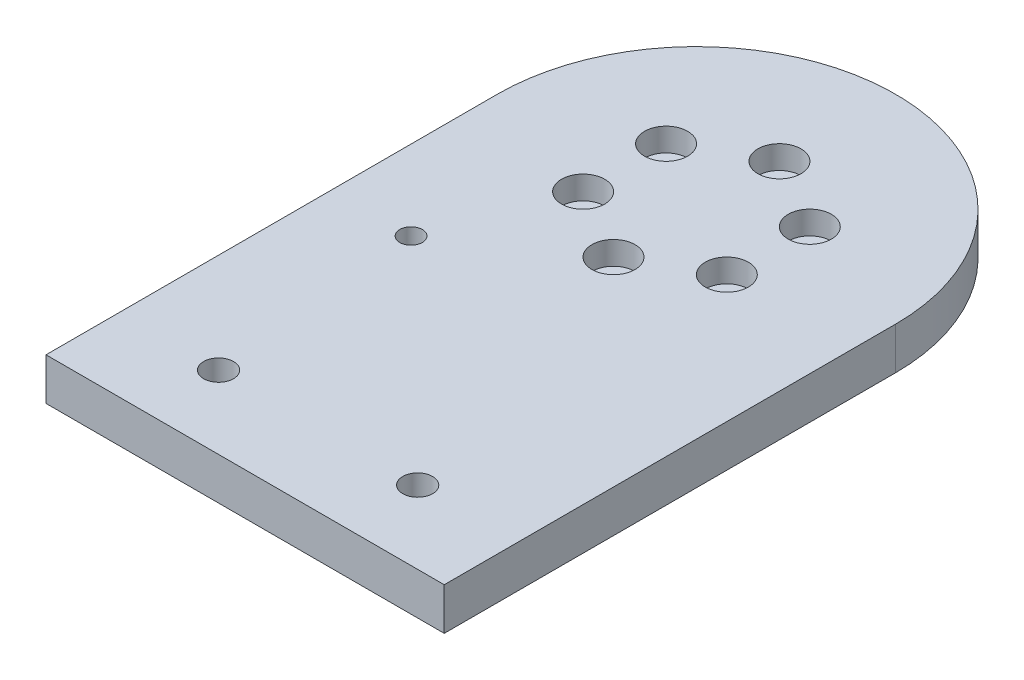
ISO-10303-21;
HEADER;
FILE_DESCRIPTION(('STEP AP214'),'2;1');
FILE_NAME('part.step','',(''),(''),'','','');
FILE_SCHEMA(('AUTOMOTIVE_DESIGN { 1 0 10303 214 1 1 1 1 }'));
ENDSEC;
DATA;
#1=APPLICATION_CONTEXT('core data for automotive mechanical design processes');
#2=APPLICATION_PROTOCOL_DEFINITION('international standard','automotive_design',2000,#1);
#3=PRODUCT_CONTEXT('',#1,'mechanical');
#4=PRODUCT('Part','Part','',(#3));
#5=PRODUCT_RELATED_PRODUCT_CATEGORY('part','',(#4));
#6=PRODUCT_DEFINITION_FORMATION('','',#4);
#7=PRODUCT_DEFINITION_CONTEXT('part definition',#1,'design');
#8=PRODUCT_DEFINITION('design','',#6,#7);
#9=PRODUCT_DEFINITION_SHAPE('','',#8);
#10=(LENGTH_UNIT() NAMED_UNIT(*) SI_UNIT(.MILLI.,.METRE.));
#11=(NAMED_UNIT(*) PLANE_ANGLE_UNIT() SI_UNIT($,.RADIAN.));
#12=(NAMED_UNIT(*) SI_UNIT($,.STERADIAN.) SOLID_ANGLE_UNIT());
#13=UNCERTAINTY_MEASURE_WITH_UNIT(LENGTH_MEASURE(1.E-05),#10,'distance_accuracy_value','');
#14=(GEOMETRIC_REPRESENTATION_CONTEXT(3) GLOBAL_UNCERTAINTY_ASSIGNED_CONTEXT((#13)) GLOBAL_UNIT_ASSIGNED_CONTEXT((#10,
#11,#12)) REPRESENTATION_CONTEXT('',''));
#15=CARTESIAN_POINT('',(0.,0.,0.));
#16=DIRECTION('',(0.,0.,1.));
#17=DIRECTION('',(1.,0.,0.));
#18=AXIS2_PLACEMENT_3D('',#15,#16,#17);
#19=CARTESIAN_POINT('',(10.8253175473055,66.1,336.25));
#20=DIRECTION('',(0.,-1.,0.));
#21=DIRECTION('',(0.,0.,-1.));
#22=AXIS2_PLACEMENT_3D('',#19,#20,#21);
#23=CYLINDRICAL_SURFACE('',#22,1.7);
#24=CARTESIAN_POINT('',(10.8253175473055,59.75,336.25));
#25=DIRECTION('',(0.,1.,0.));
#26=DIRECTION('',(0.,0.,1.));
#27=AXIS2_PLACEMENT_3D('',#24,#25,#26);
#28=CIRCLE('',#27,1.7);
#29=CARTESIAN_POINT('',(10.8253175473055,59.75,337.95));
#30=VERTEX_POINT('',#29);
#31=EDGE_CURVE('E151',#30,#30,#28,.T.);
#32=ORIENTED_EDGE('',*,*,#31,.F.);
#33=EDGE_LOOP('',(#32));
#34=FACE_BOUND('',#33,.T.);
#35=CARTESIAN_POINT('',(10.8253175473055,62.6,336.25));
#36=DIRECTION('',(0.,1.,0.));
#37=DIRECTION('',(0.,0.,1.));
#38=AXIS2_PLACEMENT_3D('',#35,#36,#37);
#39=CIRCLE('',#38,1.7);
#40=CARTESIAN_POINT('',(10.8253175473055,62.6,337.95));
#41=VERTEX_POINT('',#40);
#42=EDGE_CURVE('E43',#41,#41,#39,.T.);
#43=ORIENTED_EDGE('',*,*,#42,.T.);
#44=EDGE_LOOP('',(#43));
#45=FACE_BOUND('',#44,.T.);
#46=ADVANCED_FACE('F39',(#34,#45),#23,.F.);
#47=CARTESIAN_POINT('',(0.,66.1,342.5));
#48=DIRECTION('',(0.,-1.,0.));
#49=DIRECTION('',(0.,0.,-1.));
#50=AXIS2_PLACEMENT_3D('',#47,#48,#49);
#51=CYLINDRICAL_SURFACE('',#50,1.7);
#52=CARTESIAN_POINT('',(0.,59.75,342.5));
#53=DIRECTION('',(0.,1.,0.));
#54=DIRECTION('',(0.,0.,1.));
#55=AXIS2_PLACEMENT_3D('',#52,#53,#54);
#56=CIRCLE('',#55,1.7);
#57=CARTESIAN_POINT('',(0.,59.75,344.2));
#58=VERTEX_POINT('',#57);
#59=EDGE_CURVE('E147',#58,#58,#56,.T.);
#60=ORIENTED_EDGE('',*,*,#59,.F.);
#61=EDGE_LOOP('',(#60));
#62=FACE_BOUND('',#61,.T.);
#63=CARTESIAN_POINT('',(0.,62.6,342.5));
#64=DIRECTION('',(0.,1.,0.));
#65=DIRECTION('',(0.,0.,1.));
#66=AXIS2_PLACEMENT_3D('',#63,#64,#65);
#67=CIRCLE('',#66,1.7);
#68=CARTESIAN_POINT('',(0.,62.6,344.2));
#69=VERTEX_POINT('',#68);
#70=EDGE_CURVE('E183',#69,#69,#67,.T.);
#71=ORIENTED_EDGE('',*,*,#70,.T.);
#72=EDGE_LOOP('',(#71));
#73=FACE_BOUND('',#72,.T.);
#74=ADVANCED_FACE('F211',(#62,#73),#51,.F.);
#75=CARTESIAN_POINT('',(-10.8253175473055,66.1,336.25));
#76=DIRECTION('',(0.,-1.,0.));
#77=DIRECTION('',(0.,0.,-1.));
#78=AXIS2_PLACEMENT_3D('',#75,#76,#77);
#79=CYLINDRICAL_SURFACE('',#78,1.7);
#80=CARTESIAN_POINT('',(-10.8253175473055,59.75,336.25));
#81=DIRECTION('',(0.,1.,0.));
#82=DIRECTION('',(0.,0.,1.));
#83=AXIS2_PLACEMENT_3D('',#80,#81,#82);
#84=CIRCLE('',#83,1.7);
#85=CARTESIAN_POINT('',(-10.8253175473055,59.75,337.95));
#86=VERTEX_POINT('',#85);
#87=EDGE_CURVE('E155',#86,#86,#84,.T.);
#88=ORIENTED_EDGE('',*,*,#87,.F.);
#89=EDGE_LOOP('',(#88));
#90=FACE_BOUND('',#89,.T.);
#91=CARTESIAN_POINT('',(-10.8253175473055,62.6,336.25));
#92=DIRECTION('',(0.,1.,0.));
#93=DIRECTION('',(0.,0.,1.));
#94=AXIS2_PLACEMENT_3D('',#91,#92,#93);
#95=CIRCLE('',#94,1.7);
#96=CARTESIAN_POINT('',(-10.8253175473055,62.6,337.95));
#97=VERTEX_POINT('',#96);
#98=EDGE_CURVE('E185',#97,#97,#95,.T.);
#99=ORIENTED_EDGE('',*,*,#98,.T.);
#100=EDGE_LOOP('',(#99));
#101=FACE_BOUND('',#100,.T.);
#102=ADVANCED_FACE('F218',(#90,#101),#79,.F.);
#103=CARTESIAN_POINT('',(-10.8253175473055,66.1,323.75));
#104=DIRECTION('',(0.,-1.,0.));
#105=DIRECTION('',(0.,0.,-1.));
#106=AXIS2_PLACEMENT_3D('',#103,#104,#105);
#107=CYLINDRICAL_SURFACE('',#106,1.7);
#108=CARTESIAN_POINT('',(-10.8253175473055,59.75,323.75));
#109=DIRECTION('',(0.,1.,0.));
#110=DIRECTION('',(0.,0.,1.));
#111=AXIS2_PLACEMENT_3D('',#108,#109,#110);
#112=CIRCLE('',#111,1.7);
#113=CARTESIAN_POINT('',(-10.8253175473055,59.75,325.45));
#114=VERTEX_POINT('',#113);
#115=EDGE_CURVE('E154',#114,#114,#112,.T.);
#116=ORIENTED_EDGE('',*,*,#115,.F.);
#117=EDGE_LOOP('',(#116));
#118=FACE_BOUND('',#117,.T.);
#119=CARTESIAN_POINT('',(-10.8253175473055,62.6,323.75));
#120=DIRECTION('',(0.,1.,0.));
#121=DIRECTION('',(0.,0.,1.));
#122=AXIS2_PLACEMENT_3D('',#119,#120,#121);
#123=CIRCLE('',#122,1.7);
#124=CARTESIAN_POINT('',(-10.8253175473055,62.6,325.45));
#125=VERTEX_POINT('',#124);
#126=EDGE_CURVE('E177',#125,#125,#123,.T.);
#127=ORIENTED_EDGE('',*,*,#126,.T.);
#128=EDGE_LOOP('',(#127));
#129=FACE_BOUND('',#128,.T.);
#130=ADVANCED_FACE('F249',(#118,#129),#107,.F.);
#131=CARTESIAN_POINT('',(0.,66.1,317.5));
#132=DIRECTION('',(0.,-1.,0.));
#133=DIRECTION('',(0.,0.,-1.));
#134=AXIS2_PLACEMENT_3D('',#131,#132,#133);
#135=CYLINDRICAL_SURFACE('',#134,1.7);
#136=CARTESIAN_POINT('',(0.,59.75,317.5));
#137=DIRECTION('',(0.,1.,0.));
#138=DIRECTION('',(0.,0.,1.));
#139=AXIS2_PLACEMENT_3D('',#136,#137,#138);
#140=CIRCLE('',#139,1.7);
#141=CARTESIAN_POINT('',(0.,59.75,319.2));
#142=VERTEX_POINT('',#141);
#143=EDGE_CURVE('E157',#142,#142,#140,.T.);
#144=ORIENTED_EDGE('',*,*,#143,.F.);
#145=EDGE_LOOP('',(#144));
#146=FACE_BOUND('',#145,.T.);
#147=CARTESIAN_POINT('',(0.,62.6,317.5));
#148=DIRECTION('',(0.,1.,0.));
#149=DIRECTION('',(0.,0.,1.));
#150=AXIS2_PLACEMENT_3D('',#147,#148,#149);
#151=CIRCLE('',#150,1.7);
#152=CARTESIAN_POINT('',(0.,62.6,319.2));
#153=VERTEX_POINT('',#152);
#154=EDGE_CURVE('E176',#153,#153,#151,.T.);
#155=ORIENTED_EDGE('',*,*,#154,.T.);
#156=EDGE_LOOP('',(#155));
#157=FACE_BOUND('',#156,.T.);
#158=ADVANCED_FACE('F243',(#146,#157),#135,.F.);
#159=CARTESIAN_POINT('',(10.8253175473055,66.1,323.75));
#160=DIRECTION('',(0.,-1.,0.));
#161=DIRECTION('',(0.,0.,-1.));
#162=AXIS2_PLACEMENT_3D('',#159,#160,#161);
#163=CYLINDRICAL_SURFACE('',#162,1.7);
#164=CARTESIAN_POINT('',(10.8253175473055,59.75,323.75));
#165=DIRECTION('',(0.,1.,0.));
#166=DIRECTION('',(0.,0.,1.));
#167=AXIS2_PLACEMENT_3D('',#164,#165,#166);
#168=CIRCLE('',#167,1.7);
#169=CARTESIAN_POINT('',(10.8253175473055,59.75,325.45));
#170=VERTEX_POINT('',#169);
#171=EDGE_CURVE('E163',#170,#170,#168,.T.);
#172=ORIENTED_EDGE('',*,*,#171,.F.);
#173=EDGE_LOOP('',(#172));
#174=FACE_BOUND('',#173,.T.);
#175=CARTESIAN_POINT('',(10.8253175473055,62.6,323.75));
#176=DIRECTION('',(0.,1.,0.));
#177=DIRECTION('',(0.,0.,1.));
#178=AXIS2_PLACEMENT_3D('',#175,#176,#177);
#179=CIRCLE('',#178,1.7);
#180=CARTESIAN_POINT('',(10.8253175473055,62.6,325.45));
#181=VERTEX_POINT('',#180);
#182=EDGE_CURVE('E143',#181,#181,#179,.T.);
#183=ORIENTED_EDGE('',*,*,#182,.T.);
#184=EDGE_LOOP('',(#183));
#185=FACE_BOUND('',#184,.T.);
#186=ADVANCED_FACE('F222',(#174,#185),#163,.F.);
#187=CARTESIAN_POINT('',(30.,66.1,379.));
#188=DIRECTION('',(-1.,0.,0.));
#189=DIRECTION('',(0.,0.,1.));
#190=AXIS2_PLACEMENT_3D('',#187,#188,#189);
#191=PLANE('',#190);
#192=DIRECTION('',(0.,0.,-1.));
#193=VECTOR('',#192,1.);
#194=CARTESIAN_POINT('',(30.,59.75,379.));
#195=LINE('',#194,#193);
#196=CARTESIAN_POINT('',(30.,59.75,398.));
#197=VERTEX_POINT('',#196);
#198=CARTESIAN_POINT('',(30.,59.75,330.));
#199=VERTEX_POINT('',#198);
#200=EDGE_CURVE('E170',#197,#199,#195,.T.);
#201=ORIENTED_EDGE('',*,*,#200,.T.);
#202=DIRECTION('',(0.,-1.,0.));
#203=VECTOR('',#202,1.);
#204=CARTESIAN_POINT('',(30.,66.1,330.));
#205=LINE('',#204,#203);
#206=CARTESIAN_POINT('',(30.,66.1,330.));
#207=VERTEX_POINT('',#206);
#208=EDGE_CURVE('E11',#207,#199,#205,.T.);
#209=ORIENTED_EDGE('',*,*,#208,.F.);
#210=DIRECTION('',(0.,0.,-1.));
#211=VECTOR('',#210,1.);
#212=CARTESIAN_POINT('',(30.,66.1,379.));
#213=LINE('',#212,#211);
#214=CARTESIAN_POINT('',(30.,66.1,398.));
#215=VERTEX_POINT('',#214);
#216=EDGE_CURVE('E88',#215,#207,#213,.T.);
#217=ORIENTED_EDGE('',*,*,#216,.F.);
#218=DIRECTION('',(0.,-1.,0.));
#219=VECTOR('',#218,1.);
#220=CARTESIAN_POINT('',(30.,66.1,398.));
#221=LINE('',#220,#219);
#222=EDGE_CURVE('E100',#215,#197,#221,.T.);
#223=ORIENTED_EDGE('',*,*,#222,.T.);
#224=EDGE_LOOP('',(#201,#209,#217,#223));
#225=FACE_BOUND('',#224,.T.);
#226=ADVANCED_FACE('F41',(#225),#191,.F.);
#227=CARTESIAN_POINT('',(-30.,66.1,379.));
#228=DIRECTION('',(1.,0.,0.));
#229=DIRECTION('',(0.,0.,-1.));
#230=AXIS2_PLACEMENT_3D('',#227,#228,#229);
#231=PLANE('',#230);
#232=DIRECTION('',(0.,0.,1.));
#233=VECTOR('',#232,1.);
#234=CARTESIAN_POINT('',(-30.,59.75,379.));
#235=LINE('',#234,#233);
#236=CARTESIAN_POINT('',(-30.,59.75,330.));
#237=VERTEX_POINT('',#236);
#238=CARTESIAN_POINT('',(-30.,59.75,398.));
#239=VERTEX_POINT('',#238);
#240=EDGE_CURVE('E95',#237,#239,#235,.T.);
#241=ORIENTED_EDGE('',*,*,#240,.T.);
#242=DIRECTION('',(0.,-1.,0.));
#243=VECTOR('',#242,1.);
#244=CARTESIAN_POINT('',(-30.,66.1,398.));
#245=LINE('',#244,#243);
#246=CARTESIAN_POINT('',(-30.,66.1,398.));
#247=VERTEX_POINT('',#246);
#248=EDGE_CURVE('E93',#247,#239,#245,.T.);
#249=ORIENTED_EDGE('',*,*,#248,.F.);
#250=DIRECTION('',(0.,0.,1.));
#251=VECTOR('',#250,1.);
#252=CARTESIAN_POINT('',(-30.,66.1,379.));
#253=LINE('',#252,#251);
#254=CARTESIAN_POINT('',(-30.,66.1,330.));
#255=VERTEX_POINT('',#254);
#256=EDGE_CURVE('E79',#255,#247,#253,.T.);
#257=ORIENTED_EDGE('',*,*,#256,.F.);
#258=DIRECTION('',(0.,-1.,0.));
#259=VECTOR('',#258,1.);
#260=CARTESIAN_POINT('',(-30.,66.1,330.));
#261=LINE('',#260,#259);
#262=EDGE_CURVE('E48',#255,#237,#261,.T.);
#263=ORIENTED_EDGE('',*,*,#262,.T.);
#264=EDGE_LOOP('',(#241,#249,#257,#263));
#265=FACE_BOUND('',#264,.T.);
#266=ADVANCED_FACE('F94',(#265),#231,.F.);
#267=CARTESIAN_POINT('',(0.,66.1,0.));
#268=DIRECTION('',(0.,-1.,0.));
#269=DIRECTION('',(0.,0.,-1.));
#270=AXIS2_PLACEMENT_3D('',#267,#268,#269);
#271=PLANE('',#270);
#272=CARTESIAN_POINT('',(-18.,66.1,355.));
#273=DIRECTION('',(0.,1.,0.));
#274=DIRECTION('',(0.,0.,1.));
#275=AXIS2_PLACEMENT_3D('',#272,#273,#274);
#276=CIRCLE('',#275,1.7);
#277=CARTESIAN_POINT('',(-18.,66.1,356.7));
#278=VERTEX_POINT('',#277);
#279=EDGE_CURVE('E311',#278,#278,#276,.T.);
#280=ORIENTED_EDGE('',*,*,#279,.F.);
#281=EDGE_LOOP('',(#280));
#282=FACE_BOUND('',#281,.T.);
#283=CARTESIAN_POINT('',(-15.,66.1,387.));
#284=DIRECTION('',(0.,1.,0.));
#285=DIRECTION('',(0.,0.,1.));
#286=AXIS2_PLACEMENT_3D('',#283,#284,#285);
#287=CIRCLE('',#286,2.25);
#288=CARTESIAN_POINT('',(-15.,66.1,389.25));
#289=VERTEX_POINT('',#288);
#290=EDGE_CURVE('E106',#289,#289,#287,.T.);
#291=ORIENTED_EDGE('',*,*,#290,.F.);
#292=EDGE_LOOP('',(#291));
#293=FACE_BOUND('',#292,.T.);
#294=CARTESIAN_POINT('',(15.,66.1,387.));
#295=DIRECTION('',(0.,1.,0.));
#296=DIRECTION('',(0.,0.,1.));
#297=AXIS2_PLACEMENT_3D('',#294,#295,#296);
#298=CIRCLE('',#297,2.25);
#299=CARTESIAN_POINT('',(15.,66.1,389.25));
#300=VERTEX_POINT('',#299);
#301=EDGE_CURVE('E107',#300,#300,#298,.T.);
#302=ORIENTED_EDGE('',*,*,#301,.F.);
#303=EDGE_LOOP('',(#302));
#304=FACE_BOUND('',#303,.T.);
#305=CARTESIAN_POINT('',(10.8253175473055,66.1,323.75));
#306=DIRECTION('',(0.,1.,0.));
#307=DIRECTION('',(0.,0.,1.));
#308=AXIS2_PLACEMENT_3D('',#305,#306,#307);
#309=CIRCLE('',#308,3.25);
#310=CARTESIAN_POINT('',(10.8253175473055,66.1,327.));
#311=VERTEX_POINT('',#310);
#312=EDGE_CURVE('E96',#311,#311,#309,.T.);
#313=ORIENTED_EDGE('',*,*,#312,.F.);
#314=EDGE_LOOP('',(#313));
#315=FACE_BOUND('',#314,.T.);
#316=CARTESIAN_POINT('',(0.,66.1,317.5));
#317=DIRECTION('',(0.,1.,0.));
#318=DIRECTION('',(0.,0.,1.));
#319=AXIS2_PLACEMENT_3D('',#316,#317,#318);
#320=CIRCLE('',#319,3.25);
#321=CARTESIAN_POINT('',(0.,66.1,320.75));
#322=VERTEX_POINT('',#321);
#323=EDGE_CURVE('E132',#322,#322,#320,.T.);
#324=ORIENTED_EDGE('',*,*,#323,.F.);
#325=EDGE_LOOP('',(#324));
#326=FACE_BOUND('',#325,.T.);
#327=CARTESIAN_POINT('',(-10.8253175473055,66.1,323.75));
#328=DIRECTION('',(0.,1.,0.));
#329=DIRECTION('',(0.,0.,1.));
#330=AXIS2_PLACEMENT_3D('',#327,#328,#329);
#331=CIRCLE('',#330,3.25);
#332=CARTESIAN_POINT('',(-10.8253175473055,66.1,327.));
#333=VERTEX_POINT('',#332);
#334=EDGE_CURVE('E127',#333,#333,#331,.T.);
#335=ORIENTED_EDGE('',*,*,#334,.F.);
#336=EDGE_LOOP('',(#335));
#337=FACE_BOUND('',#336,.T.);
#338=CARTESIAN_POINT('',(-10.8253175473055,66.1,336.25));
#339=DIRECTION('',(0.,1.,0.));
#340=DIRECTION('',(0.,0.,1.));
#341=AXIS2_PLACEMENT_3D('',#338,#339,#340);
#342=CIRCLE('',#341,3.25);
#343=CARTESIAN_POINT('',(-10.8253175473055,66.1,339.5));
#344=VERTEX_POINT('',#343);
#345=EDGE_CURVE('E125',#344,#344,#342,.T.);
#346=ORIENTED_EDGE('',*,*,#345,.F.);
#347=EDGE_LOOP('',(#346));
#348=FACE_BOUND('',#347,.T.);
#349=CARTESIAN_POINT('',(0.,66.1,342.5));
#350=DIRECTION('',(0.,1.,0.));
#351=DIRECTION('',(0.,0.,1.));
#352=AXIS2_PLACEMENT_3D('',#349,#350,#351);
#353=CIRCLE('',#352,3.25);
#354=CARTESIAN_POINT('',(0.,66.1,345.75));
#355=VERTEX_POINT('',#354);
#356=EDGE_CURVE('E116',#355,#355,#353,.T.);
#357=ORIENTED_EDGE('',*,*,#356,.F.);
#358=EDGE_LOOP('',(#357));
#359=FACE_BOUND('',#358,.T.);
#360=CARTESIAN_POINT('',(10.8253175473055,66.1,336.25));
#361=DIRECTION('',(0.,1.,0.));
#362=DIRECTION('',(0.,0.,1.));
#363=AXIS2_PLACEMENT_3D('',#360,#361,#362);
#364=CIRCLE('',#363,3.25);
#365=CARTESIAN_POINT('',(10.8253175473055,66.1,339.5));
#366=VERTEX_POINT('',#365);
#367=EDGE_CURVE('E145',#366,#366,#364,.T.);
#368=ORIENTED_EDGE('',*,*,#367,.F.);
#369=EDGE_LOOP('',(#368));
#370=FACE_BOUND('',#369,.T.);
#371=ORIENTED_EDGE('',*,*,#216,.T.);
#372=CARTESIAN_POINT('',(0.,66.1,330.));
#373=DIRECTION('',(0.,1.,0.));
#374=DIRECTION('',(0.,0.,1.));
#375=AXIS2_PLACEMENT_3D('',#372,#373,#374);
#376=CIRCLE('',#375,30.);
#377=EDGE_CURVE('E86',#207,#255,#376,.T.);
#378=ORIENTED_EDGE('',*,*,#377,.T.);
#379=ORIENTED_EDGE('',*,*,#256,.T.);
#380=DIRECTION('',(1.,0.,0.));
#381=VECTOR('',#380,1.);
#382=CARTESIAN_POINT('',(-30.,66.1,398.));
#383=LINE('',#382,#381);
#384=EDGE_CURVE('E83',#247,#215,#383,.T.);
#385=ORIENTED_EDGE('',*,*,#384,.T.);
#386=EDGE_LOOP('',(#371,#378,#379,#385));
#387=FACE_BOUND('',#386,.T.);
#388=ADVANCED_FACE('F85',(#282,#293,#304,#315,#326,#337,#348,#359,#370,#387),#271,.F.);
#389=CARTESIAN_POINT('',(0.,59.75,0.));
#390=DIRECTION('',(0.,-1.,0.));
#391=DIRECTION('',(0.,0.,-1.));
#392=AXIS2_PLACEMENT_3D('',#389,#390,#391);
#393=PLANE('',#392);
#394=CARTESIAN_POINT('',(-18.,59.75,355.));
#395=DIRECTION('',(0.,1.,0.));
#396=DIRECTION('',(0.,0.,1.));
#397=AXIS2_PLACEMENT_3D('',#394,#395,#396);
#398=CIRCLE('',#397,1.7);
#399=CARTESIAN_POINT('',(-18.,59.75,356.7));
#400=VERTEX_POINT('',#399);
#401=EDGE_CURVE('E313',#400,#400,#398,.T.);
#402=ORIENTED_EDGE('',*,*,#401,.T.);
#403=EDGE_LOOP('',(#402));
#404=FACE_BOUND('',#403,.T.);
#405=CARTESIAN_POINT('',(-15.,59.75,387.));
#406=DIRECTION('',(0.,1.,0.));
#407=DIRECTION('',(0.,0.,1.));
#408=AXIS2_PLACEMENT_3D('',#405,#406,#407);
#409=CIRCLE('',#408,2.25);
#410=CARTESIAN_POINT('',(-15.,59.75,389.25));
#411=VERTEX_POINT('',#410);
#412=EDGE_CURVE('E318',#411,#411,#409,.T.);
#413=ORIENTED_EDGE('',*,*,#412,.T.);
#414=EDGE_LOOP('',(#413));
#415=FACE_BOUND('',#414,.T.);
#416=CARTESIAN_POINT('',(15.,59.75,387.));
#417=DIRECTION('',(0.,1.,0.));
#418=DIRECTION('',(0.,0.,1.));
#419=AXIS2_PLACEMENT_3D('',#416,#417,#418);
#420=CIRCLE('',#419,2.25);
#421=CARTESIAN_POINT('',(15.,59.75,389.25));
#422=VERTEX_POINT('',#421);
#423=EDGE_CURVE('E325',#422,#422,#420,.T.);
#424=ORIENTED_EDGE('',*,*,#423,.T.);
#425=EDGE_LOOP('',(#424));
#426=FACE_BOUND('',#425,.T.);
#427=ORIENTED_EDGE('',*,*,#171,.T.);
#428=EDGE_LOOP('',(#427));
#429=FACE_BOUND('',#428,.T.);
#430=ORIENTED_EDGE('',*,*,#143,.T.);
#431=EDGE_LOOP('',(#430));
#432=FACE_BOUND('',#431,.T.);
#433=ORIENTED_EDGE('',*,*,#115,.T.);
#434=EDGE_LOOP('',(#433));
#435=FACE_BOUND('',#434,.T.);
#436=ORIENTED_EDGE('',*,*,#87,.T.);
#437=EDGE_LOOP('',(#436));
#438=FACE_BOUND('',#437,.T.);
#439=ORIENTED_EDGE('',*,*,#59,.T.);
#440=EDGE_LOOP('',(#439));
#441=FACE_BOUND('',#440,.T.);
#442=ORIENTED_EDGE('',*,*,#31,.T.);
#443=EDGE_LOOP('',(#442));
#444=FACE_BOUND('',#443,.T.);
#445=ORIENTED_EDGE('',*,*,#240,.F.);
#446=CARTESIAN_POINT('',(0.,59.75,330.));
#447=DIRECTION('',(0.,1.,0.));
#448=DIRECTION('',(0.,0.,1.));
#449=AXIS2_PLACEMENT_3D('',#446,#447,#448);
#450=CIRCLE('',#449,30.);
#451=EDGE_CURVE('E54',#199,#237,#450,.T.);
#452=ORIENTED_EDGE('',*,*,#451,.F.);
#453=ORIENTED_EDGE('',*,*,#200,.F.);
#454=DIRECTION('',(1.,0.,0.));
#455=VECTOR('',#454,1.);
#456=CARTESIAN_POINT('',(-30.,59.75,398.));
#457=LINE('',#456,#455);
#458=EDGE_CURVE('E101',#239,#197,#457,.T.);
#459=ORIENTED_EDGE('',*,*,#458,.F.);
#460=EDGE_LOOP('',(#445,#452,#453,#459));
#461=FACE_BOUND('',#460,.T.);
#462=ADVANCED_FACE('F226',(#404,#415,#426,#429,#432,#435,#438,#441,#444,#461),#393,.T.);
#463=CARTESIAN_POINT('',(0.,66.1,330.));
#464=DIRECTION('',(0.,-1.,0.));
#465=DIRECTION('',(0.,0.,-1.));
#466=AXIS2_PLACEMENT_3D('',#463,#464,#465);
#467=CYLINDRICAL_SURFACE('',#466,30.);
#468=ORIENTED_EDGE('',*,*,#377,.F.);
#469=ORIENTED_EDGE('',*,*,#208,.T.);
#470=ORIENTED_EDGE('',*,*,#451,.T.);
#471=ORIENTED_EDGE('',*,*,#262,.F.);
#472=EDGE_LOOP('',(#468,#469,#470,#471));
#473=FACE_BOUND('',#472,.T.);
#474=ADVANCED_FACE('F221',(#473),#467,.T.);
#475=CARTESIAN_POINT('',(10.8253175473055,66.1,323.75));
#476=DIRECTION('',(0.,-1.,0.));
#477=DIRECTION('',(0.,0.,-1.));
#478=AXIS2_PLACEMENT_3D('',#475,#476,#477);
#479=CYLINDRICAL_SURFACE('',#478,3.25);
#480=ORIENTED_EDGE('',*,*,#312,.T.);
#481=EDGE_LOOP('',(#480));
#482=FACE_BOUND('',#481,.T.);
#483=CARTESIAN_POINT('',(10.8253175473055,62.6,323.75));
#484=DIRECTION('',(0.,1.,0.));
#485=DIRECTION('',(0.,0.,1.));
#486=AXIS2_PLACEMENT_3D('',#483,#484,#485);
#487=CIRCLE('',#486,3.25);
#488=CARTESIAN_POINT('',(10.8253175473055,62.6,327.));
#489=VERTEX_POINT('',#488);
#490=EDGE_CURVE('E139',#489,#489,#487,.T.);
#491=ORIENTED_EDGE('',*,*,#490,.F.);
#492=EDGE_LOOP('',(#491));
#493=FACE_BOUND('',#492,.T.);
#494=ADVANCED_FACE('F227',(#482,#493),#479,.F.);
#495=CARTESIAN_POINT('',(10.8253175473055,62.6,323.75));
#496=DIRECTION('',(0.,1.,0.));
#497=DIRECTION('',(0.,0.,1.));
#498=AXIS2_PLACEMENT_3D('',#495,#496,#497);
#499=PLANE('',#498);
#500=ORIENTED_EDGE('',*,*,#182,.F.);
#501=EDGE_LOOP('',(#500));
#502=FACE_BOUND('',#501,.T.);
#503=ORIENTED_EDGE('',*,*,#490,.T.);
#504=EDGE_LOOP('',(#503));
#505=FACE_BOUND('',#504,.T.);
#506=ADVANCED_FACE('F256',(#502,#505),#499,.T.);
#507=CARTESIAN_POINT('',(0.,66.1,317.5));
#508=DIRECTION('',(0.,-1.,0.));
#509=DIRECTION('',(0.,0.,-1.));
#510=AXIS2_PLACEMENT_3D('',#507,#508,#509);
#511=CYLINDRICAL_SURFACE('',#510,3.25);
#512=ORIENTED_EDGE('',*,*,#323,.T.);
#513=EDGE_LOOP('',(#512));
#514=FACE_BOUND('',#513,.T.);
#515=CARTESIAN_POINT('',(0.,62.6,317.5));
#516=DIRECTION('',(0.,1.,0.));
#517=DIRECTION('',(0.,0.,1.));
#518=AXIS2_PLACEMENT_3D('',#515,#516,#517);
#519=CIRCLE('',#518,3.25);
#520=CARTESIAN_POINT('',(0.,62.6,320.75));
#521=VERTEX_POINT('',#520);
#522=EDGE_CURVE('E131',#521,#521,#519,.T.);
#523=ORIENTED_EDGE('',*,*,#522,.F.);
#524=EDGE_LOOP('',(#523));
#525=FACE_BOUND('',#524,.T.);
#526=ADVANCED_FACE('F258',(#514,#525),#511,.F.);
#527=CARTESIAN_POINT('',(0.,62.6,317.5));
#528=DIRECTION('',(0.,1.,0.));
#529=DIRECTION('',(0.,0.,1.));
#530=AXIS2_PLACEMENT_3D('',#527,#528,#529);
#531=PLANE('',#530);
#532=ORIENTED_EDGE('',*,*,#154,.F.);
#533=EDGE_LOOP('',(#532));
#534=FACE_BOUND('',#533,.T.);
#535=ORIENTED_EDGE('',*,*,#522,.T.);
#536=EDGE_LOOP('',(#535));
#537=FACE_BOUND('',#536,.T.);
#538=ADVANCED_FACE('F267',(#534,#537),#531,.T.);
#539=CARTESIAN_POINT('',(-10.8253175473055,66.1,323.75));
#540=DIRECTION('',(0.,-1.,0.));
#541=DIRECTION('',(0.,0.,-1.));
#542=AXIS2_PLACEMENT_3D('',#539,#540,#541);
#543=CYLINDRICAL_SURFACE('',#542,3.25);
#544=ORIENTED_EDGE('',*,*,#334,.T.);
#545=EDGE_LOOP('',(#544));
#546=FACE_BOUND('',#545,.T.);
#547=CARTESIAN_POINT('',(-10.8253175473055,62.6,323.75));
#548=DIRECTION('',(0.,1.,0.));
#549=DIRECTION('',(0.,0.,1.));
#550=AXIS2_PLACEMENT_3D('',#547,#548,#549);
#551=CIRCLE('',#550,3.25);
#552=CARTESIAN_POINT('',(-10.8253175473055,62.6,327.));
#553=VERTEX_POINT('',#552);
#554=EDGE_CURVE('E123',#553,#553,#551,.T.);
#555=ORIENTED_EDGE('',*,*,#554,.F.);
#556=EDGE_LOOP('',(#555));
#557=FACE_BOUND('',#556,.T.);
#558=ADVANCED_FACE('F272',(#546,#557),#543,.F.);
#559=CARTESIAN_POINT('',(-10.8253175473055,62.6,323.75));
#560=DIRECTION('',(0.,1.,0.));
#561=DIRECTION('',(0.,0.,1.));
#562=AXIS2_PLACEMENT_3D('',#559,#560,#561);
#563=PLANE('',#562);
#564=ORIENTED_EDGE('',*,*,#126,.F.);
#565=EDGE_LOOP('',(#564));
#566=FACE_BOUND('',#565,.T.);
#567=ORIENTED_EDGE('',*,*,#554,.T.);
#568=EDGE_LOOP('',(#567));
#569=FACE_BOUND('',#568,.T.);
#570=ADVANCED_FACE('F276',(#566,#569),#563,.T.);
#571=CARTESIAN_POINT('',(-10.8253175473055,66.1,336.25));
#572=DIRECTION('',(0.,-1.,0.));
#573=DIRECTION('',(0.,0.,-1.));
#574=AXIS2_PLACEMENT_3D('',#571,#572,#573);
#575=CYLINDRICAL_SURFACE('',#574,3.25);
#576=ORIENTED_EDGE('',*,*,#345,.T.);
#577=EDGE_LOOP('',(#576));
#578=FACE_BOUND('',#577,.T.);
#579=CARTESIAN_POINT('',(-10.8253175473055,62.6,336.25));
#580=DIRECTION('',(0.,1.,0.));
#581=DIRECTION('',(0.,0.,1.));
#582=AXIS2_PLACEMENT_3D('',#579,#580,#581);
#583=CIRCLE('',#582,3.25);
#584=CARTESIAN_POINT('',(-10.8253175473055,62.6,339.5));
#585=VERTEX_POINT('',#584);
#586=EDGE_CURVE('E118',#585,#585,#583,.T.);
#587=ORIENTED_EDGE('',*,*,#586,.F.);
#588=EDGE_LOOP('',(#587));
#589=FACE_BOUND('',#588,.T.);
#590=ADVANCED_FACE('F278',(#578,#589),#575,.F.);
#591=CARTESIAN_POINT('',(-10.8253175473055,62.6,336.25));
#592=DIRECTION('',(0.,1.,0.));
#593=DIRECTION('',(0.,0.,1.));
#594=AXIS2_PLACEMENT_3D('',#591,#592,#593);
#595=PLANE('',#594);
#596=ORIENTED_EDGE('',*,*,#98,.F.);
#597=EDGE_LOOP('',(#596));
#598=FACE_BOUND('',#597,.T.);
#599=ORIENTED_EDGE('',*,*,#586,.T.);
#600=EDGE_LOOP('',(#599));
#601=FACE_BOUND('',#600,.T.);
#602=ADVANCED_FACE('F282',(#598,#601),#595,.T.);
#603=CARTESIAN_POINT('',(0.,66.1,342.5));
#604=DIRECTION('',(0.,-1.,0.));
#605=DIRECTION('',(0.,0.,-1.));
#606=AXIS2_PLACEMENT_3D('',#603,#604,#605);
#607=CYLINDRICAL_SURFACE('',#606,3.25);
#608=ORIENTED_EDGE('',*,*,#356,.T.);
#609=EDGE_LOOP('',(#608));
#610=FACE_BOUND('',#609,.T.);
#611=CARTESIAN_POINT('',(0.,62.6,342.5));
#612=DIRECTION('',(0.,1.,0.));
#613=DIRECTION('',(0.,0.,1.));
#614=AXIS2_PLACEMENT_3D('',#611,#612,#613);
#615=CIRCLE('',#614,3.25);
#616=CARTESIAN_POINT('',(0.,62.6,345.75));
#617=VERTEX_POINT('',#616);
#618=EDGE_CURVE('E115',#617,#617,#615,.T.);
#619=ORIENTED_EDGE('',*,*,#618,.F.);
#620=EDGE_LOOP('',(#619));
#621=FACE_BOUND('',#620,.T.);
#622=ADVANCED_FACE('F207',(#610,#621),#607,.F.);
#623=CARTESIAN_POINT('',(0.,62.6,342.5));
#624=DIRECTION('',(0.,1.,0.));
#625=DIRECTION('',(0.,0.,1.));
#626=AXIS2_PLACEMENT_3D('',#623,#624,#625);
#627=PLANE('',#626);
#628=ORIENTED_EDGE('',*,*,#70,.F.);
#629=EDGE_LOOP('',(#628));
#630=FACE_BOUND('',#629,.T.);
#631=ORIENTED_EDGE('',*,*,#618,.T.);
#632=EDGE_LOOP('',(#631));
#633=FACE_BOUND('',#632,.T.);
#634=ADVANCED_FACE('F199',(#630,#633),#627,.T.);
#635=CARTESIAN_POINT('',(10.8253175473055,66.1,336.25));
#636=DIRECTION('',(0.,-1.,0.));
#637=DIRECTION('',(0.,0.,-1.));
#638=AXIS2_PLACEMENT_3D('',#635,#636,#637);
#639=CYLINDRICAL_SURFACE('',#638,3.25);
#640=ORIENTED_EDGE('',*,*,#367,.T.);
#641=EDGE_LOOP('',(#640));
#642=FACE_BOUND('',#641,.T.);
#643=CARTESIAN_POINT('',(10.8253175473055,62.6,336.25));
#644=DIRECTION('',(0.,1.,0.));
#645=DIRECTION('',(0.,0.,1.));
#646=AXIS2_PLACEMENT_3D('',#643,#644,#645);
#647=CIRCLE('',#646,3.25);
#648=CARTESIAN_POINT('',(10.8253175473055,62.6,339.5));
#649=VERTEX_POINT('',#648);
#650=EDGE_CURVE('E114',#649,#649,#647,.T.);
#651=ORIENTED_EDGE('',*,*,#650,.F.);
#652=EDGE_LOOP('',(#651));
#653=FACE_BOUND('',#652,.T.);
#654=ADVANCED_FACE('F194',(#642,#653),#639,.F.);
#655=CARTESIAN_POINT('',(10.8253175473055,62.6,336.25));
#656=DIRECTION('',(0.,1.,0.));
#657=DIRECTION('',(0.,0.,1.));
#658=AXIS2_PLACEMENT_3D('',#655,#656,#657);
#659=PLANE('',#658);
#660=ORIENTED_EDGE('',*,*,#42,.F.);
#661=EDGE_LOOP('',(#660));
#662=FACE_BOUND('',#661,.T.);
#663=ORIENTED_EDGE('',*,*,#650,.T.);
#664=EDGE_LOOP('',(#663));
#665=FACE_BOUND('',#664,.T.);
#666=ADVANCED_FACE('F195',(#662,#665),#659,.T.);
#667=CARTESIAN_POINT('',(-30.,66.1,398.));
#668=DIRECTION('',(0.,0.,-1.));
#669=DIRECTION('',(-1.,0.,0.));
#670=AXIS2_PLACEMENT_3D('',#667,#668,#669);
#671=PLANE('',#670);
#672=ORIENTED_EDGE('',*,*,#458,.T.);
#673=ORIENTED_EDGE('',*,*,#222,.F.);
#674=ORIENTED_EDGE('',*,*,#384,.F.);
#675=ORIENTED_EDGE('',*,*,#248,.T.);
#676=EDGE_LOOP('',(#672,#673,#674,#675));
#677=FACE_BOUND('',#676,.T.);
#678=ADVANCED_FACE('F103',(#677),#671,.F.);
#679=CARTESIAN_POINT('',(15.,66.1,387.));
#680=DIRECTION('',(0.,-1.,0.));
#681=DIRECTION('',(0.,0.,-1.));
#682=AXIS2_PLACEMENT_3D('',#679,#680,#681);
#683=CYLINDRICAL_SURFACE('',#682,2.25);
#684=ORIENTED_EDGE('',*,*,#301,.T.);
#685=EDGE_LOOP('',(#684));
#686=FACE_BOUND('',#685,.T.);
#687=ORIENTED_EDGE('',*,*,#423,.F.);
#688=EDGE_LOOP('',(#687));
#689=FACE_BOUND('',#688,.T.);
#690=ADVANCED_FACE('F294',(#686,#689),#683,.F.);
#691=CARTESIAN_POINT('',(-15.,66.1,387.));
#692=DIRECTION('',(0.,-1.,0.));
#693=DIRECTION('',(0.,0.,-1.));
#694=AXIS2_PLACEMENT_3D('',#691,#692,#693);
#695=CYLINDRICAL_SURFACE('',#694,2.25);
#696=ORIENTED_EDGE('',*,*,#290,.T.);
#697=EDGE_LOOP('',(#696));
#698=FACE_BOUND('',#697,.T.);
#699=ORIENTED_EDGE('',*,*,#412,.F.);
#700=EDGE_LOOP('',(#699));
#701=FACE_BOUND('',#700,.T.);
#702=ADVANCED_FACE('F296',(#698,#701),#695,.F.);
#703=CARTESIAN_POINT('',(-18.,66.1,355.));
#704=DIRECTION('',(0.,-1.,0.));
#705=DIRECTION('',(0.,0.,-1.));
#706=AXIS2_PLACEMENT_3D('',#703,#704,#705);
#707=CYLINDRICAL_SURFACE('',#706,1.7);
#708=ORIENTED_EDGE('',*,*,#279,.T.);
#709=EDGE_LOOP('',(#708));
#710=FACE_BOUND('',#709,.T.);
#711=ORIENTED_EDGE('',*,*,#401,.F.);
#712=EDGE_LOOP('',(#711));
#713=FACE_BOUND('',#712,.T.);
#714=ADVANCED_FACE('F305',(#710,#713),#707,.F.);
#715=CLOSED_SHELL('',(#46,#74,#102,#130,#158,#186,#226,#266,#388,#462,#474,#494,#506,#526,#538,
#558,#570,#590,#602,#622,#634,#654,#666,#678,#690,#702,#714));
#716=MANIFOLD_SOLID_BREP('B2',#715);
#717=ADVANCED_BREP_SHAPE_REPRESENTATION('',(#18,#716),#14);
#718=SHAPE_DEFINITION_REPRESENTATION(#9,#717);
ENDSEC;
END-ISO-10303-21;
